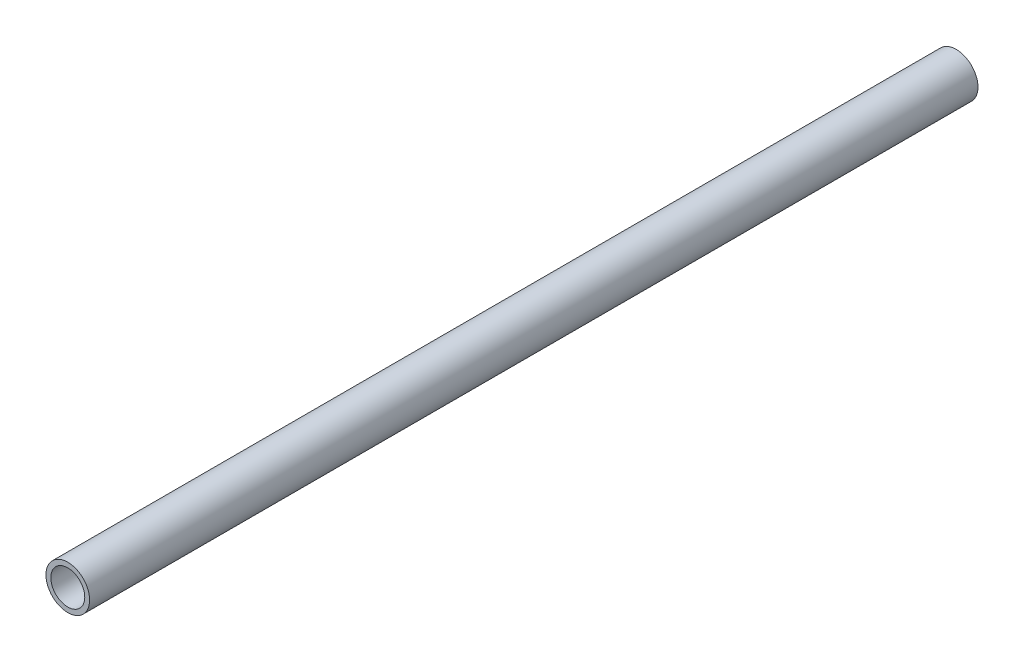
ISO-10303-21;
HEADER;
FILE_DESCRIPTION(('STEP AP214'),'2;1');
FILE_NAME('part.step','',(''),(''),'','','');
FILE_SCHEMA(('AUTOMOTIVE_DESIGN { 1 0 10303 214 1 1 1 1 }'));
ENDSEC;
DATA;
#1=APPLICATION_CONTEXT('core data for automotive mechanical design processes');
#2=APPLICATION_PROTOCOL_DEFINITION('international standard','automotive_design',2000,#1);
#3=PRODUCT_CONTEXT('',#1,'mechanical');
#4=PRODUCT('Part','Part','',(#3));
#5=PRODUCT_RELATED_PRODUCT_CATEGORY('part','',(#4));
#6=PRODUCT_DEFINITION_FORMATION('','',#4);
#7=PRODUCT_DEFINITION_CONTEXT('part definition',#1,'design');
#8=PRODUCT_DEFINITION('design','',#6,#7);
#9=PRODUCT_DEFINITION_SHAPE('','',#8);
#10=(LENGTH_UNIT() NAMED_UNIT(*) SI_UNIT(.MILLI.,.METRE.));
#11=(NAMED_UNIT(*) PLANE_ANGLE_UNIT() SI_UNIT($,.RADIAN.));
#12=(NAMED_UNIT(*) SI_UNIT($,.STERADIAN.) SOLID_ANGLE_UNIT());
#13=UNCERTAINTY_MEASURE_WITH_UNIT(LENGTH_MEASURE(1.E-05),#10,'distance_accuracy_value','');
#14=(GEOMETRIC_REPRESENTATION_CONTEXT(3) GLOBAL_UNCERTAINTY_ASSIGNED_CONTEXT((#13)) GLOBAL_UNIT_ASSIGNED_CONTEXT((#10,
#11,#12)) REPRESENTATION_CONTEXT('',''));
#15=CARTESIAN_POINT('',(0.,0.,0.));
#16=DIRECTION('',(0.,0.,1.));
#17=DIRECTION('',(1.,0.,0.));
#18=AXIS2_PLACEMENT_3D('',#15,#16,#17);
#19=CARTESIAN_POINT('',(0.,0.,366.3));
#20=DIRECTION('',(0.,0.,1.));
#21=DIRECTION('',(1.,0.,0.));
#22=AXIS2_PLACEMENT_3D('',#19,#20,#21);
#23=PLANE('',#22);
#24=CARTESIAN_POINT('',(0.,0.,366.3));
#25=DIRECTION('',(0.,0.,1.));
#26=DIRECTION('',(1.,0.,0.));
#27=AXIS2_PLACEMENT_3D('',#24,#25,#26);
#28=CIRCLE('',#27,9.);
#29=CARTESIAN_POINT('',(9.,0.,366.3));
#30=VERTEX_POINT('',#29);
#31=EDGE_CURVE('E10',#30,#30,#28,.T.);
#32=ORIENTED_EDGE('',*,*,#31,.T.);
#33=EDGE_LOOP('',(#32));
#34=FACE_BOUND('',#33,.T.);
#35=CARTESIAN_POINT('',(0.,0.,366.3));
#36=DIRECTION('',(0.,0.,1.));
#37=DIRECTION('',(1.,0.,0.));
#38=AXIS2_PLACEMENT_3D('',#35,#36,#37);
#39=CIRCLE('',#38,7.);
#40=CARTESIAN_POINT('',(7.,0.,366.3));
#41=VERTEX_POINT('',#40);
#42=EDGE_CURVE('E44',#41,#41,#39,.T.);
#43=ORIENTED_EDGE('',*,*,#42,.F.);
#44=EDGE_LOOP('',(#43));
#45=FACE_BOUND('',#44,.T.);
#46=ADVANCED_FACE('F33',(#34,#45),#23,.T.);
#47=CARTESIAN_POINT('',(0.,0.,0.));
#48=DIRECTION('',(0.,0.,1.));
#49=DIRECTION('',(1.,0.,0.));
#50=AXIS2_PLACEMENT_3D('',#47,#48,#49);
#51=PLANE('',#50);
#52=CARTESIAN_POINT('',(0.,0.,0.));
#53=DIRECTION('',(0.,0.,1.));
#54=DIRECTION('',(1.,0.,0.));
#55=AXIS2_PLACEMENT_3D('',#52,#53,#54);
#56=CIRCLE('',#55,9.);
#57=CARTESIAN_POINT('',(9.,0.,0.));
#58=VERTEX_POINT('',#57);
#59=EDGE_CURVE('E37',#58,#58,#56,.T.);
#60=ORIENTED_EDGE('',*,*,#59,.F.);
#61=EDGE_LOOP('',(#60));
#62=FACE_BOUND('',#61,.T.);
#63=CARTESIAN_POINT('',(0.,0.,0.));
#64=DIRECTION('',(0.,0.,1.));
#65=DIRECTION('',(1.,0.,0.));
#66=AXIS2_PLACEMENT_3D('',#63,#64,#65);
#67=CIRCLE('',#66,7.);
#68=CARTESIAN_POINT('',(7.,0.,0.));
#69=VERTEX_POINT('',#68);
#70=EDGE_CURVE('E46',#69,#69,#67,.T.);
#71=ORIENTED_EDGE('',*,*,#70,.T.);
#72=EDGE_LOOP('',(#71));
#73=FACE_BOUND('',#72,.T.);
#74=ADVANCED_FACE('F56',(#62,#73),#51,.F.);
#75=CARTESIAN_POINT('',(0.,0.,366.3));
#76=DIRECTION('',(0.,0.,-1.));
#77=DIRECTION('',(-1.,0.,0.));
#78=AXIS2_PLACEMENT_3D('',#75,#76,#77);
#79=CYLINDRICAL_SURFACE('',#78,9.);
#80=ORIENTED_EDGE('',*,*,#31,.F.);
#81=EDGE_LOOP('',(#80));
#82=FACE_BOUND('',#81,.T.);
#83=ORIENTED_EDGE('',*,*,#59,.T.);
#84=EDGE_LOOP('',(#83));
#85=FACE_BOUND('',#84,.T.);
#86=ADVANCED_FACE('F35',(#82,#85),#79,.T.);
#87=CARTESIAN_POINT('',(0.,0.,366.3));
#88=DIRECTION('',(0.,0.,-1.));
#89=DIRECTION('',(-1.,0.,0.));
#90=AXIS2_PLACEMENT_3D('',#87,#88,#89);
#91=CYLINDRICAL_SURFACE('',#90,7.);
#92=ORIENTED_EDGE('',*,*,#42,.T.);
#93=EDGE_LOOP('',(#92));
#94=FACE_BOUND('',#93,.T.);
#95=ORIENTED_EDGE('',*,*,#70,.F.);
#96=EDGE_LOOP('',(#95));
#97=FACE_BOUND('',#96,.T.);
#98=ADVANCED_FACE('F52',(#94,#97),#91,.F.);
#99=CLOSED_SHELL('',(#46,#74,#86,#98));
#100=MANIFOLD_SOLID_BREP('B2',#99);
#101=ADVANCED_BREP_SHAPE_REPRESENTATION('',(#18,#100),#14);
#102=SHAPE_DEFINITION_REPRESENTATION(#9,#101);
ENDSEC;
END-ISO-10303-21;
